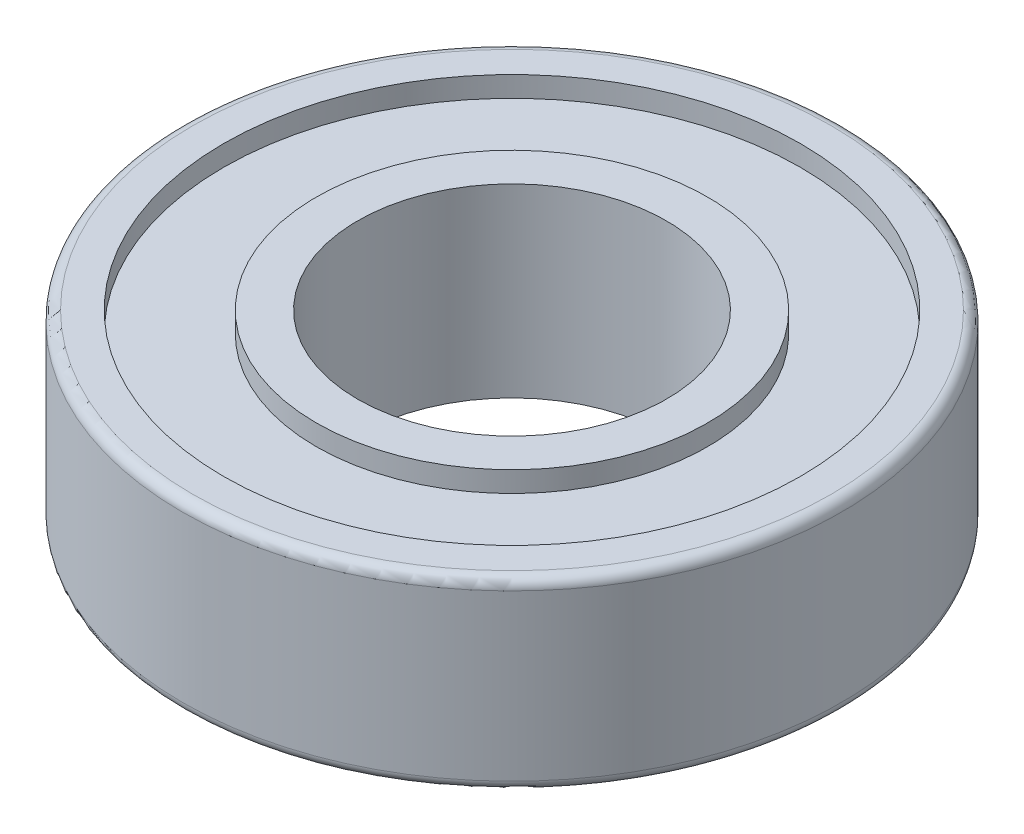
ISO-10303-21;
HEADER;
FILE_DESCRIPTION(('STEP AP214'),'2;1');
FILE_NAME('part.step','',(''),(''),'','','');
FILE_SCHEMA(('AUTOMOTIVE_DESIGN { 1 0 10303 214 1 1 1 1 }'));
ENDSEC;
DATA;
#1=APPLICATION_CONTEXT('core data for automotive mechanical design processes');
#2=APPLICATION_PROTOCOL_DEFINITION('international standard','automotive_design',2000,#1);
#3=PRODUCT_CONTEXT('',#1,'mechanical');
#4=PRODUCT('Part','Part','',(#3));
#5=PRODUCT_RELATED_PRODUCT_CATEGORY('part','',(#4));
#6=PRODUCT_DEFINITION_FORMATION('','',#4);
#7=PRODUCT_DEFINITION_CONTEXT('part definition',#1,'design');
#8=PRODUCT_DEFINITION('design','',#6,#7);
#9=PRODUCT_DEFINITION_SHAPE('','',#8);
#10=(LENGTH_UNIT() NAMED_UNIT(*) SI_UNIT(.MILLI.,.METRE.));
#11=(NAMED_UNIT(*) PLANE_ANGLE_UNIT() SI_UNIT($,.RADIAN.));
#12=(NAMED_UNIT(*) SI_UNIT($,.STERADIAN.) SOLID_ANGLE_UNIT());
#13=UNCERTAINTY_MEASURE_WITH_UNIT(LENGTH_MEASURE(1.E-05),#10,'distance_accuracy_value','');
#14=(GEOMETRIC_REPRESENTATION_CONTEXT(3) GLOBAL_UNCERTAINTY_ASSIGNED_CONTEXT((#13)) GLOBAL_UNIT_ASSIGNED_CONTEXT((#10,
#11,#12)) REPRESENTATION_CONTEXT('',''));
#15=CARTESIAN_POINT('',(0.,0.,0.));
#16=DIRECTION('',(0.,0.,1.));
#17=DIRECTION('',(1.,0.,0.));
#18=AXIS2_PLACEMENT_3D('',#15,#16,#17);
#19=CARTESIAN_POINT('',(0.,4.95,0.));
#20=DIRECTION('',(0.,1.,0.));
#21=DIRECTION('',(0.,0.,1.));
#22=AXIS2_PLACEMENT_3D('',#19,#20,#21);
#23=CYLINDRICAL_SURFACE('',#22,9.5);
#24=CARTESIAN_POINT('',(0.,-4.5,0.));
#25=DIRECTION('',(0.,1.,0.));
#26=DIRECTION('',(0.,0.,1.));
#27=AXIS2_PLACEMENT_3D('',#24,#25,#26);
#28=CIRCLE('',#27,9.5);
#29=CARTESIAN_POINT('',(0.,-4.5,9.5));
#30=VERTEX_POINT('',#29);
#31=EDGE_CURVE('E69',#30,#30,#28,.T.);
#32=ORIENTED_EDGE('',*,*,#31,.T.);
#33=EDGE_LOOP('',(#32));
#34=FACE_BOUND('',#33,.T.);
#35=CARTESIAN_POINT('',(0.,-3.5,0.));
#36=DIRECTION('',(0.,1.,0.));
#37=DIRECTION('',(0.,0.,1.));
#38=AXIS2_PLACEMENT_3D('',#35,#36,#37);
#39=CIRCLE('',#38,9.5);
#40=CARTESIAN_POINT('',(0.,-3.5,9.5));
#41=VERTEX_POINT('',#40);
#42=EDGE_CURVE('E63',#41,#41,#39,.T.);
#43=ORIENTED_EDGE('',*,*,#42,.F.);
#44=EDGE_LOOP('',(#43));
#45=FACE_BOUND('',#44,.T.);
#46=ADVANCED_FACE('F43',(#34,#45),#23,.T.);
#47=CARTESIAN_POINT('',(0.,4.5,0.));
#48=DIRECTION('',(0.,1.,0.));
#49=DIRECTION('',(0.,0.,1.));
#50=AXIS2_PLACEMENT_3D('',#47,#48,#49);
#51=CIRCLE('',#50,9.5);
#52=CARTESIAN_POINT('',(0.,4.5,9.5));
#53=VERTEX_POINT('',#52);
#54=EDGE_CURVE('E78',#53,#53,#51,.T.);
#55=ORIENTED_EDGE('',*,*,#54,.F.);
#56=EDGE_LOOP('',(#55));
#57=FACE_BOUND('',#56,.T.);
#58=CARTESIAN_POINT('',(0.,3.5,0.));
#59=DIRECTION('',(0.,-1.,0.));
#60=DIRECTION('',(0.,0.,-1.));
#61=AXIS2_PLACEMENT_3D('',#58,#59,#60);
#62=CIRCLE('',#61,9.5);
#63=CARTESIAN_POINT('',(0.,3.5,-9.5));
#64=VERTEX_POINT('',#63);
#65=EDGE_CURVE('E66',#64,#64,#62,.T.);
#66=ORIENTED_EDGE('',*,*,#65,.F.);
#67=EDGE_LOOP('',(#66));
#68=FACE_BOUND('',#67,.T.);
#69=ADVANCED_FACE('F111',(#57,#68),#23,.T.);
#70=CARTESIAN_POINT('',(7.5,-4.5,0.));
#71=DIRECTION('',(0.,1.,0.));
#72=DIRECTION('',(0.,0.,1.));
#73=AXIS2_PLACEMENT_3D('',#70,#71,#72);
#74=PLANE('',#73);
#75=ORIENTED_EDGE('',*,*,#31,.F.);
#76=EDGE_LOOP('',(#75));
#77=FACE_BOUND('',#76,.T.);
#78=CARTESIAN_POINT('',(0.,-4.5,0.));
#79=DIRECTION('',(0.,1.,0.));
#80=DIRECTION('',(0.,0.,1.));
#81=AXIS2_PLACEMENT_3D('',#78,#79,#80);
#82=CIRCLE('',#81,7.5);
#83=CARTESIAN_POINT('',(0.,-4.5,7.5));
#84=VERTEX_POINT('',#83);
#85=EDGE_CURVE('E72',#84,#84,#82,.T.);
#86=ORIENTED_EDGE('',*,*,#85,.T.);
#87=EDGE_LOOP('',(#86));
#88=FACE_BOUND('',#87,.T.);
#89=ADVANCED_FACE('F118',(#77,#88),#74,.F.);
#90=CARTESIAN_POINT('',(0.,4.95,0.));
#91=DIRECTION('',(0.,1.,0.));
#92=DIRECTION('',(0.,0.,1.));
#93=AXIS2_PLACEMENT_3D('',#90,#91,#92);
#94=CYLINDRICAL_SURFACE('',#93,7.5);
#95=ORIENTED_EDGE('',*,*,#85,.F.);
#96=EDGE_LOOP('',(#95));
#97=FACE_BOUND('',#96,.T.);
#98=CARTESIAN_POINT('',(0.,4.5,0.));
#99=DIRECTION('',(0.,1.,0.));
#100=DIRECTION('',(0.,0.,1.));
#101=AXIS2_PLACEMENT_3D('',#98,#99,#100);
#102=CIRCLE('',#101,7.5);
#103=CARTESIAN_POINT('',(0.,4.5,7.5));
#104=VERTEX_POINT('',#103);
#105=EDGE_CURVE('E75',#104,#104,#102,.T.);
#106=ORIENTED_EDGE('',*,*,#105,.T.);
#107=EDGE_LOOP('',(#106));
#108=FACE_BOUND('',#107,.T.);
#109=ADVANCED_FACE('F124',(#97,#108),#94,.F.);
#110=CARTESIAN_POINT('',(7.5,4.5,0.));
#111=DIRECTION('',(0.,-1.,0.));
#112=DIRECTION('',(0.,0.,-1.));
#113=AXIS2_PLACEMENT_3D('',#110,#111,#112);
#114=PLANE('',#113);
#115=ORIENTED_EDGE('',*,*,#105,.F.);
#116=EDGE_LOOP('',(#115));
#117=FACE_BOUND('',#116,.T.);
#118=ORIENTED_EDGE('',*,*,#54,.T.);
#119=EDGE_LOOP('',(#118));
#120=FACE_BOUND('',#119,.T.);
#121=ADVANCED_FACE('F128',(#117,#120),#114,.F.);
#122=CARTESIAN_POINT('',(9.5,-3.5,0.));
#123=DIRECTION('',(0.,1.,0.));
#124=DIRECTION('',(0.,0.,1.));
#125=AXIS2_PLACEMENT_3D('',#122,#123,#124);
#126=PLANE('',#125);
#127=CARTESIAN_POINT('',(0.,-3.5,0.));
#128=DIRECTION('',(0.,1.,0.));
#129=DIRECTION('',(0.,0.,1.));
#130=AXIS2_PLACEMENT_3D('',#127,#128,#129);
#131=CIRCLE('',#130,14.);
#132=CARTESIAN_POINT('',(0.,-3.5,14.));
#133=VERTEX_POINT('',#132);
#134=EDGE_CURVE('E81',#133,#133,#131,.T.);
#135=ORIENTED_EDGE('',*,*,#134,.F.);
#136=EDGE_LOOP('',(#135));
#137=FACE_BOUND('',#136,.T.);
#138=ORIENTED_EDGE('',*,*,#42,.T.);
#139=EDGE_LOOP('',(#138));
#140=FACE_BOUND('',#139,.T.);
#141=ADVANCED_FACE('F131',(#137,#140),#126,.F.);
#142=CARTESIAN_POINT('',(9.5,3.5,0.));
#143=DIRECTION('',(0.,-1.,0.));
#144=DIRECTION('',(0.,0.,-1.));
#145=AXIS2_PLACEMENT_3D('',#142,#143,#144);
#146=PLANE('',#145);
#147=ORIENTED_EDGE('',*,*,#65,.T.);
#148=EDGE_LOOP('',(#147));
#149=FACE_BOUND('',#148,.T.);
#150=CARTESIAN_POINT('',(0.,3.5,0.));
#151=DIRECTION('',(0.,-1.,0.));
#152=DIRECTION('',(0.,0.,-1.));
#153=AXIS2_PLACEMENT_3D('',#150,#151,#152);
#154=CIRCLE('',#153,14.);
#155=CARTESIAN_POINT('',(0.,3.5,-14.));
#156=VERTEX_POINT('',#155);
#157=EDGE_CURVE('E84',#156,#156,#154,.T.);
#158=ORIENTED_EDGE('',*,*,#157,.F.);
#159=EDGE_LOOP('',(#158));
#160=FACE_BOUND('',#159,.T.);
#161=ADVANCED_FACE('F135',(#149,#160),#146,.F.);
#162=CARTESIAN_POINT('',(0.,4.95,0.));
#163=DIRECTION('',(0.,1.,0.));
#164=DIRECTION('',(0.,0.,1.));
#165=AXIS2_PLACEMENT_3D('',#162,#163,#164);
#166=CYLINDRICAL_SURFACE('',#165,14.);
#167=CARTESIAN_POINT('',(0.,-4.5,0.));
#168=DIRECTION('',(0.,1.,0.));
#169=DIRECTION('',(0.,0.,1.));
#170=AXIS2_PLACEMENT_3D('',#167,#168,#169);
#171=CIRCLE('',#170,14.);
#172=CARTESIAN_POINT('',(0.,-4.5,14.));
#173=VERTEX_POINT('',#172);
#174=EDGE_CURVE('E87',#173,#173,#171,.T.);
#175=ORIENTED_EDGE('',*,*,#174,.F.);
#176=EDGE_LOOP('',(#175));
#177=FACE_BOUND('',#176,.T.);
#178=ORIENTED_EDGE('',*,*,#134,.T.);
#179=EDGE_LOOP('',(#178));
#180=FACE_BOUND('',#179,.T.);
#181=ADVANCED_FACE('F139',(#177,#180),#166,.F.);
#182=CARTESIAN_POINT('',(0.,4.5,0.));
#183=DIRECTION('',(0.,1.,0.));
#184=DIRECTION('',(0.,0.,1.));
#185=AXIS2_PLACEMENT_3D('',#182,#183,#184);
#186=CIRCLE('',#185,14.);
#187=CARTESIAN_POINT('',(0.,4.5,14.));
#188=VERTEX_POINT('',#187);
#189=EDGE_CURVE('E90',#188,#188,#186,.T.);
#190=ORIENTED_EDGE('',*,*,#189,.T.);
#191=EDGE_LOOP('',(#190));
#192=FACE_BOUND('',#191,.T.);
#193=ORIENTED_EDGE('',*,*,#157,.T.);
#194=EDGE_LOOP('',(#193));
#195=FACE_BOUND('',#194,.T.);
#196=ADVANCED_FACE('F94',(#192,#195),#166,.F.);
#197=CARTESIAN_POINT('',(0.,4.95,0.));
#198=DIRECTION('',(0.,1.,0.));
#199=DIRECTION('',(0.,0.,1.));
#200=AXIS2_PLACEMENT_3D('',#197,#198,#199);
#201=CYLINDRICAL_SURFACE('',#200,16.);
#202=CARTESIAN_POINT('',(0.,-4.,0.));
#203=DIRECTION('',(0.,1.,0.));
#204=DIRECTION('',(0.,0.,1.));
#205=AXIS2_PLACEMENT_3D('',#202,#203,#204);
#206=CIRCLE('',#205,16.);
#207=CARTESIAN_POINT('',(0.,-4.,16.));
#208=VERTEX_POINT('',#207);
#209=EDGE_CURVE('E54',#208,#208,#206,.T.);
#210=ORIENTED_EDGE('',*,*,#209,.T.);
#211=EDGE_LOOP('',(#210));
#212=FACE_BOUND('',#211,.T.);
#213=CARTESIAN_POINT('',(0.,4.,0.));
#214=DIRECTION('',(0.,-1.,0.));
#215=DIRECTION('',(0.,0.,-1.));
#216=AXIS2_PLACEMENT_3D('',#213,#214,#215);
#217=CIRCLE('',#216,16.);
#218=CARTESIAN_POINT('',(0.,4.,-16.));
#219=VERTEX_POINT('',#218);
#220=EDGE_CURVE('E58',#219,#219,#217,.T.);
#221=ORIENTED_EDGE('',*,*,#220,.T.);
#222=EDGE_LOOP('',(#221));
#223=FACE_BOUND('',#222,.T.);
#224=ADVANCED_FACE('F107',(#212,#223),#201,.T.);
#225=CARTESIAN_POINT('',(14.,-4.5,0.));
#226=DIRECTION('',(0.,1.,0.));
#227=DIRECTION('',(0.,0.,1.));
#228=AXIS2_PLACEMENT_3D('',#225,#226,#227);
#229=PLANE('',#228);
#230=CARTESIAN_POINT('',(0.,-4.5,0.));
#231=DIRECTION('',(0.,1.,0.));
#232=DIRECTION('',(0.,0.,1.));
#233=AXIS2_PLACEMENT_3D('',#230,#231,#232);
#234=CIRCLE('',#233,15.5);
#235=CARTESIAN_POINT('',(0.,-4.5,15.5));
#236=VERTEX_POINT('',#235);
#237=EDGE_CURVE('E50',#236,#236,#234,.F.);
#238=ORIENTED_EDGE('',*,*,#237,.T.);
#239=EDGE_LOOP('',(#238));
#240=FACE_BOUND('',#239,.T.);
#241=ORIENTED_EDGE('',*,*,#174,.T.);
#242=EDGE_LOOP('',(#241));
#243=FACE_BOUND('',#242,.T.);
#244=ADVANCED_FACE('F100',(#240,#243),#229,.F.);
#245=CARTESIAN_POINT('',(14.,4.5,0.));
#246=DIRECTION('',(0.,-1.,0.));
#247=DIRECTION('',(0.,0.,-1.));
#248=AXIS2_PLACEMENT_3D('',#245,#246,#247);
#249=PLANE('',#248);
#250=CARTESIAN_POINT('',(0.,4.5,0.));
#251=DIRECTION('',(0.,-1.,0.));
#252=DIRECTION('',(0.,0.,-1.));
#253=AXIS2_PLACEMENT_3D('',#250,#251,#252);
#254=CIRCLE('',#253,15.5);
#255=CARTESIAN_POINT('',(0.,4.5,-15.5));
#256=VERTEX_POINT('',#255);
#257=EDGE_CURVE('E10',#256,#256,#254,.F.);
#258=ORIENTED_EDGE('',*,*,#257,.T.);
#259=EDGE_LOOP('',(#258));
#260=FACE_BOUND('',#259,.T.);
#261=ORIENTED_EDGE('',*,*,#189,.F.);
#262=EDGE_LOOP('',(#261));
#263=FACE_BOUND('',#262,.T.);
#264=ADVANCED_FACE('F97',(#260,#263),#249,.F.);
#265=CARTESIAN_POINT('',(0.,-4.,0.));
#266=DIRECTION('',(0.,1.,0.));
#267=DIRECTION('',(0.,0.,1.));
#268=AXIS2_PLACEMENT_3D('',#265,#266,#267);
#269=TOROIDAL_SURFACE('',#268,15.5,0.5);
#270=ORIENTED_EDGE('',*,*,#237,.F.);
#271=EDGE_LOOP('',(#270));
#272=FACE_BOUND('',#271,.T.);
#273=ORIENTED_EDGE('',*,*,#209,.F.);
#274=EDGE_LOOP('',(#273));
#275=FACE_BOUND('',#274,.T.);
#276=ADVANCED_FACE('F99',(#272,#275),#269,.T.);
#277=CARTESIAN_POINT('',(0.,4.,0.));
#278=DIRECTION('',(0.,-1.,0.));
#279=DIRECTION('',(0.,0.,-1.));
#280=AXIS2_PLACEMENT_3D('',#277,#278,#279);
#281=TOROIDAL_SURFACE('',#280,15.5,0.5);
#282=ORIENTED_EDGE('',*,*,#220,.F.);
#283=EDGE_LOOP('',(#282));
#284=FACE_BOUND('',#283,.T.);
#285=ORIENTED_EDGE('',*,*,#257,.F.);
#286=EDGE_LOOP('',(#285));
#287=FACE_BOUND('',#286,.T.);
#288=ADVANCED_FACE('F45',(#284,#287),#281,.T.);
#289=CLOSED_SHELL('',(#46,#69,#89,#109,#121,#141,#161,#181,#196,#224,#244,#264,#276,#288));
#290=MANIFOLD_SOLID_BREP('B2',#289);
#291=ADVANCED_BREP_SHAPE_REPRESENTATION('',(#18,#290),#14);
#292=SHAPE_DEFINITION_REPRESENTATION(#9,#291);
ENDSEC;
END-ISO-10303-21;
